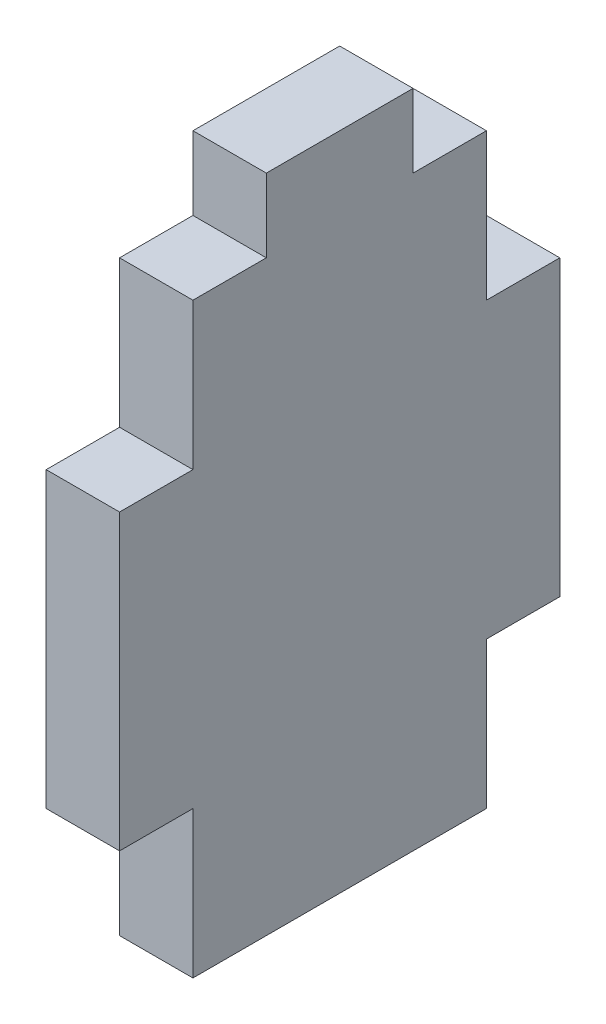
ISO-10303-21;
HEADER;
FILE_DESCRIPTION(('STEP AP214'),'2;1');
FILE_NAME('part.step','',(''),(''),'','','');
FILE_SCHEMA(('AUTOMOTIVE_DESIGN { 1 0 10303 214 1 1 1 1 }'));
ENDSEC;
DATA;
#1=APPLICATION_CONTEXT('core data for automotive mechanical design processes');
#2=APPLICATION_PROTOCOL_DEFINITION('international standard','automotive_design',2000,#1);
#3=PRODUCT_CONTEXT('',#1,'mechanical');
#4=PRODUCT('Part','Part','',(#3));
#5=PRODUCT_RELATED_PRODUCT_CATEGORY('part','',(#4));
#6=PRODUCT_DEFINITION_FORMATION('','',#4);
#7=PRODUCT_DEFINITION_CONTEXT('part definition',#1,'design');
#8=PRODUCT_DEFINITION('design','',#6,#7);
#9=PRODUCT_DEFINITION_SHAPE('','',#8);
#10=(LENGTH_UNIT() NAMED_UNIT(*) SI_UNIT(.MILLI.,.METRE.));
#11=(NAMED_UNIT(*) PLANE_ANGLE_UNIT() SI_UNIT($,.RADIAN.));
#12=(NAMED_UNIT(*) SI_UNIT($,.STERADIAN.) SOLID_ANGLE_UNIT());
#13=UNCERTAINTY_MEASURE_WITH_UNIT(LENGTH_MEASURE(1.E-05),#10,'distance_accuracy_value','');
#14=(GEOMETRIC_REPRESENTATION_CONTEXT(3) GLOBAL_UNCERTAINTY_ASSIGNED_CONTEXT((#13)) GLOBAL_UNIT_ASSIGNED_CONTEXT((#10,
#11,#12)) REPRESENTATION_CONTEXT('',''));
#15=CARTESIAN_POINT('',(0.,0.,0.));
#16=DIRECTION('',(0.,0.,1.));
#17=DIRECTION('',(1.,0.,0.));
#18=AXIS2_PLACEMENT_3D('',#15,#16,#17);
#19=CARTESIAN_POINT('',(5.,0.,0.));
#20=DIRECTION('',(0.,0.,1.));
#21=DIRECTION('',(0.,-1.,0.));
#22=AXIS2_PLACEMENT_3D('',#19,#20,#21);
#23=PLANE('',#22);
#24=DIRECTION('',(0.,1.,0.));
#25=VECTOR('',#24,1.);
#26=CARTESIAN_POINT('',(0.,0.,0.));
#27=LINE('',#26,#25);
#28=CARTESIAN_POINT('',(0.,0.,0.));
#29=VERTEX_POINT('',#28);
#30=CARTESIAN_POINT('',(0.,10.,0.));
#31=VERTEX_POINT('',#30);
#32=EDGE_CURVE('E178',#29,#31,#27,.T.);
#33=ORIENTED_EDGE('',*,*,#32,.T.);
#34=DIRECTION('',(-1.,0.,0.));
#35=VECTOR('',#34,1.);
#36=CARTESIAN_POINT('',(5.,10.,0.));
#37=LINE('',#36,#35);
#38=CARTESIAN_POINT('',(5.,10.,0.));
#39=VERTEX_POINT('',#38);
#40=EDGE_CURVE('E11',#39,#31,#37,.T.);
#41=ORIENTED_EDGE('',*,*,#40,.F.);
#42=DIRECTION('',(0.,1.,0.));
#43=VECTOR('',#42,1.);
#44=CARTESIAN_POINT('',(5.,0.,0.));
#45=LINE('',#44,#43);
#46=CARTESIAN_POINT('',(5.,0.,0.));
#47=VERTEX_POINT('',#46);
#48=EDGE_CURVE('E208',#47,#39,#45,.T.);
#49=ORIENTED_EDGE('',*,*,#48,.F.);
#50=DIRECTION('',(-1.,0.,0.));
#51=VECTOR('',#50,1.);
#52=CARTESIAN_POINT('',(5.,0.,0.));
#53=LINE('',#52,#51);
#54=EDGE_CURVE('E174',#47,#29,#53,.T.);
#55=ORIENTED_EDGE('',*,*,#54,.T.);
#56=EDGE_LOOP('',(#33,#41,#49,#55));
#57=FACE_BOUND('',#56,.T.);
#58=ADVANCED_FACE('F34',(#57),#23,.F.);
#59=CARTESIAN_POINT('',(5.,10.,0.));
#60=DIRECTION('',(0.,1.,0.));
#61=DIRECTION('',(0.,0.,1.));
#62=AXIS2_PLACEMENT_3D('',#59,#60,#61);
#63=PLANE('',#62);
#64=DIRECTION('',(0.,0.,-1.));
#65=VECTOR('',#64,1.);
#66=CARTESIAN_POINT('',(0.,10.,0.));
#67=LINE('',#66,#65);
#68=CARTESIAN_POINT('',(0.,10.,-5.));
#69=VERTEX_POINT('',#68);
#70=EDGE_CURVE('E181',#31,#69,#67,.T.);
#71=ORIENTED_EDGE('',*,*,#70,.T.);
#72=DIRECTION('',(-1.,0.,0.));
#73=VECTOR('',#72,1.);
#74=CARTESIAN_POINT('',(5.,10.,-5.));
#75=LINE('',#74,#73);
#76=CARTESIAN_POINT('',(5.,10.,-5.));
#77=VERTEX_POINT('',#76);
#78=EDGE_CURVE('E42',#77,#69,#75,.T.);
#79=ORIENTED_EDGE('',*,*,#78,.F.);
#80=DIRECTION('',(0.,0.,-1.));
#81=VECTOR('',#80,1.);
#82=CARTESIAN_POINT('',(5.,10.,0.));
#83=LINE('',#82,#81);
#84=EDGE_CURVE('E117',#39,#77,#83,.T.);
#85=ORIENTED_EDGE('',*,*,#84,.F.);
#86=ORIENTED_EDGE('',*,*,#40,.T.);
#87=EDGE_LOOP('',(#71,#79,#85,#86));
#88=FACE_BOUND('',#87,.T.);
#89=ADVANCED_FACE('F306',(#88),#63,.F.);
#90=CARTESIAN_POINT('',(5.,30.,-5.));
#91=DIRECTION('',(0.,0.,1.));
#92=DIRECTION('',(0.,-1.,0.));
#93=AXIS2_PLACEMENT_3D('',#90,#91,#92);
#94=PLANE('',#93);
#95=DIRECTION('',(0.,1.,0.));
#96=VECTOR('',#95,1.);
#97=CARTESIAN_POINT('',(0.,30.,-5.));
#98=LINE('',#97,#96);
#99=CARTESIAN_POINT('',(0.,30.,-5.));
#100=VERTEX_POINT('',#99);
#101=EDGE_CURVE('E183',#69,#100,#98,.T.);
#102=ORIENTED_EDGE('',*,*,#101,.T.);
#103=DIRECTION('',(-1.,0.,0.));
#104=VECTOR('',#103,1.);
#105=CARTESIAN_POINT('',(5.,30.,-5.));
#106=LINE('',#105,#104);
#107=CARTESIAN_POINT('',(5.,30.,-5.));
#108=VERTEX_POINT('',#107);
#109=EDGE_CURVE('E239',#108,#100,#106,.T.);
#110=ORIENTED_EDGE('',*,*,#109,.F.);
#111=DIRECTION('',(0.,1.,0.));
#112=VECTOR('',#111,1.);
#113=CARTESIAN_POINT('',(5.,30.,-5.));
#114=LINE('',#113,#112);
#115=EDGE_CURVE('E247',#77,#108,#114,.T.);
#116=ORIENTED_EDGE('',*,*,#115,.F.);
#117=ORIENTED_EDGE('',*,*,#78,.T.);
#118=EDGE_LOOP('',(#102,#110,#116,#117));
#119=FACE_BOUND('',#118,.T.);
#120=ADVANCED_FACE('F245',(#119),#94,.F.);
#121=CARTESIAN_POINT('',(5.,30.,0.));
#122=DIRECTION('',(0.,-1.,0.));
#123=DIRECTION('',(0.,0.,-1.));
#124=AXIS2_PLACEMENT_3D('',#121,#122,#123);
#125=PLANE('',#124);
#126=DIRECTION('',(0.,0.,1.));
#127=VECTOR('',#126,1.);
#128=CARTESIAN_POINT('',(0.,30.,0.));
#129=LINE('',#128,#127);
#130=CARTESIAN_POINT('',(0.,30.,0.));
#131=VERTEX_POINT('',#130);
#132=EDGE_CURVE('E185',#100,#131,#129,.T.);
#133=ORIENTED_EDGE('',*,*,#132,.T.);
#134=DIRECTION('',(-1.,0.,0.));
#135=VECTOR('',#134,1.);
#136=CARTESIAN_POINT('',(5.,30.,0.));
#137=LINE('',#136,#135);
#138=CARTESIAN_POINT('',(5.,30.,0.));
#139=VERTEX_POINT('',#138);
#140=EDGE_CURVE('E236',#139,#131,#137,.T.);
#141=ORIENTED_EDGE('',*,*,#140,.F.);
#142=DIRECTION('',(0.,0.,1.));
#143=VECTOR('',#142,1.);
#144=CARTESIAN_POINT('',(5.,30.,0.));
#145=LINE('',#144,#143);
#146=EDGE_CURVE('E265',#108,#139,#145,.T.);
#147=ORIENTED_EDGE('',*,*,#146,.F.);
#148=ORIENTED_EDGE('',*,*,#109,.T.);
#149=EDGE_LOOP('',(#133,#141,#147,#148));
#150=FACE_BOUND('',#149,.T.);
#151=ADVANCED_FACE('F256',(#150),#125,.F.);
#152=CARTESIAN_POINT('',(5.,30.,0.));
#153=DIRECTION('',(0.,0.,1.));
#154=DIRECTION('',(0.,-1.,0.));
#155=AXIS2_PLACEMENT_3D('',#152,#153,#154);
#156=PLANE('',#155);
#157=DIRECTION('',(0.,1.,0.));
#158=VECTOR('',#157,1.);
#159=CARTESIAN_POINT('',(0.,30.,0.));
#160=LINE('',#159,#158);
#161=CARTESIAN_POINT('',(0.,40.,0.));
#162=VERTEX_POINT('',#161);
#163=EDGE_CURVE('E187',#131,#162,#160,.T.);
#164=ORIENTED_EDGE('',*,*,#163,.T.);
#165=DIRECTION('',(-1.,0.,0.));
#166=VECTOR('',#165,1.);
#167=CARTESIAN_POINT('',(5.,40.,0.));
#168=LINE('',#167,#166);
#169=CARTESIAN_POINT('',(5.,40.,0.));
#170=VERTEX_POINT('',#169);
#171=EDGE_CURVE('E233',#170,#162,#168,.T.);
#172=ORIENTED_EDGE('',*,*,#171,.F.);
#173=DIRECTION('',(0.,1.,0.));
#174=VECTOR('',#173,1.);
#175=CARTESIAN_POINT('',(5.,30.,0.));
#176=LINE('',#175,#174);
#177=EDGE_CURVE('E262',#139,#170,#176,.T.);
#178=ORIENTED_EDGE('',*,*,#177,.F.);
#179=ORIENTED_EDGE('',*,*,#140,.T.);
#180=EDGE_LOOP('',(#164,#172,#178,#179));
#181=FACE_BOUND('',#180,.T.);
#182=ADVANCED_FACE('F260',(#181),#156,.F.);
#183=CARTESIAN_POINT('',(5.,40.,0.));
#184=DIRECTION('',(0.,-1.,0.));
#185=DIRECTION('',(0.,0.,-1.));
#186=AXIS2_PLACEMENT_3D('',#183,#184,#185);
#187=PLANE('',#186);
#188=DIRECTION('',(0.,0.,1.));
#189=VECTOR('',#188,1.);
#190=CARTESIAN_POINT('',(0.,40.,0.));
#191=LINE('',#190,#189);
#192=CARTESIAN_POINT('',(0.,40.,5.));
#193=VERTEX_POINT('',#192);
#194=EDGE_CURVE('E189',#162,#193,#191,.T.);
#195=ORIENTED_EDGE('',*,*,#194,.T.);
#196=DIRECTION('',(-1.,0.,0.));
#197=VECTOR('',#196,1.);
#198=CARTESIAN_POINT('',(5.,40.,5.));
#199=LINE('',#198,#197);
#200=CARTESIAN_POINT('',(5.,40.,5.));
#201=VERTEX_POINT('',#200);
#202=EDGE_CURVE('E230',#201,#193,#199,.T.);
#203=ORIENTED_EDGE('',*,*,#202,.F.);
#204=DIRECTION('',(0.,0.,1.));
#205=VECTOR('',#204,1.);
#206=CARTESIAN_POINT('',(5.,40.,0.));
#207=LINE('',#206,#205);
#208=EDGE_CURVE('E264',#170,#201,#207,.T.);
#209=ORIENTED_EDGE('',*,*,#208,.F.);
#210=ORIENTED_EDGE('',*,*,#171,.T.);
#211=EDGE_LOOP('',(#195,#203,#209,#210));
#212=FACE_BOUND('',#211,.T.);
#213=ADVANCED_FACE('F319',(#212),#187,.F.);
#214=CARTESIAN_POINT('',(5.,40.,5.));
#215=DIRECTION('',(0.,0.,1.));
#216=DIRECTION('',(0.,-1.,0.));
#217=AXIS2_PLACEMENT_3D('',#214,#215,#216);
#218=PLANE('',#217);
#219=DIRECTION('',(0.,1.,0.));
#220=VECTOR('',#219,1.);
#221=CARTESIAN_POINT('',(0.,40.,5.));
#222=LINE('',#221,#220);
#223=CARTESIAN_POINT('',(0.,45.,5.));
#224=VERTEX_POINT('',#223);
#225=EDGE_CURVE('E191',#193,#224,#222,.T.);
#226=ORIENTED_EDGE('',*,*,#225,.T.);
#227=DIRECTION('',(-1.,0.,0.));
#228=VECTOR('',#227,1.);
#229=CARTESIAN_POINT('',(5.,45.,5.));
#230=LINE('',#229,#228);
#231=CARTESIAN_POINT('',(5.,45.,5.));
#232=VERTEX_POINT('',#231);
#233=EDGE_CURVE('E227',#232,#224,#230,.T.);
#234=ORIENTED_EDGE('',*,*,#233,.F.);
#235=DIRECTION('',(0.,1.,0.));
#236=VECTOR('',#235,1.);
#237=CARTESIAN_POINT('',(5.,40.,5.));
#238=LINE('',#237,#236);
#239=EDGE_CURVE('E267',#201,#232,#238,.T.);
#240=ORIENTED_EDGE('',*,*,#239,.F.);
#241=ORIENTED_EDGE('',*,*,#202,.T.);
#242=EDGE_LOOP('',(#226,#234,#240,#241));
#243=FACE_BOUND('',#242,.T.);
#244=ADVANCED_FACE('F322',(#243),#218,.F.);
#245=CARTESIAN_POINT('',(5.,45.,15.));
#246=DIRECTION('',(0.,-1.,0.));
#247=DIRECTION('',(0.,0.,-1.));
#248=AXIS2_PLACEMENT_3D('',#245,#246,#247);
#249=PLANE('',#248);
#250=DIRECTION('',(0.,0.,1.));
#251=VECTOR('',#250,1.);
#252=CARTESIAN_POINT('',(0.,45.,15.));
#253=LINE('',#252,#251);
#254=CARTESIAN_POINT('',(0.,45.,15.));
#255=VERTEX_POINT('',#254);
#256=EDGE_CURVE('E193',#224,#255,#253,.T.);
#257=ORIENTED_EDGE('',*,*,#256,.T.);
#258=DIRECTION('',(-1.,0.,0.));
#259=VECTOR('',#258,1.);
#260=CARTESIAN_POINT('',(5.,45.,15.));
#261=LINE('',#260,#259);
#262=CARTESIAN_POINT('',(5.,45.,15.));
#263=VERTEX_POINT('',#262);
#264=EDGE_CURVE('E224',#263,#255,#261,.T.);
#265=ORIENTED_EDGE('',*,*,#264,.F.);
#266=DIRECTION('',(0.,0.,1.));
#267=VECTOR('',#266,1.);
#268=CARTESIAN_POINT('',(5.,45.,15.));
#269=LINE('',#268,#267);
#270=EDGE_CURVE('E273',#232,#263,#269,.T.);
#271=ORIENTED_EDGE('',*,*,#270,.F.);
#272=ORIENTED_EDGE('',*,*,#233,.T.);
#273=EDGE_LOOP('',(#257,#265,#271,#272));
#274=FACE_BOUND('',#273,.T.);
#275=ADVANCED_FACE('F326',(#274),#249,.F.);
#276=CARTESIAN_POINT('',(5.,40.,15.));
#277=DIRECTION('',(0.,0.,-1.));
#278=DIRECTION('',(-1.,0.,0.));
#279=AXIS2_PLACEMENT_3D('',#276,#277,#278);
#280=PLANE('',#279);
#281=DIRECTION('',(0.,-1.,0.));
#282=VECTOR('',#281,1.);
#283=CARTESIAN_POINT('',(0.,40.,15.));
#284=LINE('',#283,#282);
#285=CARTESIAN_POINT('',(0.,40.,15.));
#286=VERTEX_POINT('',#285);
#287=EDGE_CURVE('E195',#255,#286,#284,.T.);
#288=ORIENTED_EDGE('',*,*,#287,.T.);
#289=DIRECTION('',(-1.,0.,0.));
#290=VECTOR('',#289,1.);
#291=CARTESIAN_POINT('',(5.,40.,15.));
#292=LINE('',#291,#290);
#293=CARTESIAN_POINT('',(5.,40.,15.));
#294=VERTEX_POINT('',#293);
#295=EDGE_CURVE('E221',#294,#286,#292,.T.);
#296=ORIENTED_EDGE('',*,*,#295,.F.);
#297=DIRECTION('',(0.,-1.,0.));
#298=VECTOR('',#297,1.);
#299=CARTESIAN_POINT('',(5.,40.,15.));
#300=LINE('',#299,#298);
#301=EDGE_CURVE('E275',#263,#294,#300,.T.);
#302=ORIENTED_EDGE('',*,*,#301,.F.);
#303=ORIENTED_EDGE('',*,*,#264,.T.);
#304=EDGE_LOOP('',(#288,#296,#302,#303));
#305=FACE_BOUND('',#304,.T.);
#306=ADVANCED_FACE('F330',(#305),#280,.F.);
#307=CARTESIAN_POINT('',(5.,40.,15.));
#308=DIRECTION('',(0.,-1.,0.));
#309=DIRECTION('',(0.,0.,-1.));
#310=AXIS2_PLACEMENT_3D('',#307,#308,#309);
#311=PLANE('',#310);
#312=DIRECTION('',(0.,0.,1.));
#313=VECTOR('',#312,1.);
#314=CARTESIAN_POINT('',(0.,40.,15.));
#315=LINE('',#314,#313);
#316=CARTESIAN_POINT('',(0.,40.,20.));
#317=VERTEX_POINT('',#316);
#318=EDGE_CURVE('E197',#286,#317,#315,.T.);
#319=ORIENTED_EDGE('',*,*,#318,.T.);
#320=DIRECTION('',(-1.,0.,0.));
#321=VECTOR('',#320,1.);
#322=CARTESIAN_POINT('',(5.,40.,20.));
#323=LINE('',#322,#321);
#324=CARTESIAN_POINT('',(5.,40.,20.));
#325=VERTEX_POINT('',#324);
#326=EDGE_CURVE('E218',#325,#317,#323,.T.);
#327=ORIENTED_EDGE('',*,*,#326,.F.);
#328=DIRECTION('',(0.,0.,1.));
#329=VECTOR('',#328,1.);
#330=CARTESIAN_POINT('',(5.,40.,15.));
#331=LINE('',#330,#329);
#332=EDGE_CURVE('E277',#294,#325,#331,.T.);
#333=ORIENTED_EDGE('',*,*,#332,.F.);
#334=ORIENTED_EDGE('',*,*,#295,.T.);
#335=EDGE_LOOP('',(#319,#327,#333,#334));
#336=FACE_BOUND('',#335,.T.);
#337=ADVANCED_FACE('F334',(#336),#311,.F.);
#338=CARTESIAN_POINT('',(5.,30.,20.));
#339=DIRECTION('',(0.,0.,-1.));
#340=DIRECTION('',(-1.,0.,0.));
#341=AXIS2_PLACEMENT_3D('',#338,#339,#340);
#342=PLANE('',#341);
#343=DIRECTION('',(0.,-1.,0.));
#344=VECTOR('',#343,1.);
#345=CARTESIAN_POINT('',(0.,30.,20.));
#346=LINE('',#345,#344);
#347=CARTESIAN_POINT('',(0.,30.,20.));
#348=VERTEX_POINT('',#347);
#349=EDGE_CURVE('E199',#317,#348,#346,.T.);
#350=ORIENTED_EDGE('',*,*,#349,.T.);
#351=DIRECTION('',(-1.,0.,0.));
#352=VECTOR('',#351,1.);
#353=CARTESIAN_POINT('',(5.,30.,20.));
#354=LINE('',#353,#352);
#355=CARTESIAN_POINT('',(5.,30.,20.));
#356=VERTEX_POINT('',#355);
#357=EDGE_CURVE('E215',#356,#348,#354,.T.);
#358=ORIENTED_EDGE('',*,*,#357,.F.);
#359=DIRECTION('',(0.,-1.,0.));
#360=VECTOR('',#359,1.);
#361=CARTESIAN_POINT('',(5.,30.,20.));
#362=LINE('',#361,#360);
#363=EDGE_CURVE('E279',#325,#356,#362,.T.);
#364=ORIENTED_EDGE('',*,*,#363,.F.);
#365=ORIENTED_EDGE('',*,*,#326,.T.);
#366=EDGE_LOOP('',(#350,#358,#364,#365));
#367=FACE_BOUND('',#366,.T.);
#368=ADVANCED_FACE('F338',(#367),#342,.F.);
#369=CARTESIAN_POINT('',(5.,30.,20.));
#370=DIRECTION('',(0.,-1.,0.));
#371=DIRECTION('',(0.,0.,-1.));
#372=AXIS2_PLACEMENT_3D('',#369,#370,#371);
#373=PLANE('',#372);
#374=DIRECTION('',(0.,0.,1.));
#375=VECTOR('',#374,1.);
#376=CARTESIAN_POINT('',(0.,30.,20.));
#377=LINE('',#376,#375);
#378=CARTESIAN_POINT('',(0.,30.,25.));
#379=VERTEX_POINT('',#378);
#380=EDGE_CURVE('E201',#348,#379,#377,.T.);
#381=ORIENTED_EDGE('',*,*,#380,.T.);
#382=DIRECTION('',(-1.,0.,0.));
#383=VECTOR('',#382,1.);
#384=CARTESIAN_POINT('',(5.,30.,25.));
#385=LINE('',#384,#383);
#386=CARTESIAN_POINT('',(5.,30.,25.));
#387=VERTEX_POINT('',#386);
#388=EDGE_CURVE('E212',#387,#379,#385,.T.);
#389=ORIENTED_EDGE('',*,*,#388,.F.);
#390=DIRECTION('',(0.,0.,1.));
#391=VECTOR('',#390,1.);
#392=CARTESIAN_POINT('',(5.,30.,20.));
#393=LINE('',#392,#391);
#394=EDGE_CURVE('E281',#356,#387,#393,.T.);
#395=ORIENTED_EDGE('',*,*,#394,.F.);
#396=ORIENTED_EDGE('',*,*,#357,.T.);
#397=EDGE_LOOP('',(#381,#389,#395,#396));
#398=FACE_BOUND('',#397,.T.);
#399=ADVANCED_FACE('F287',(#398),#373,.F.);
#400=CARTESIAN_POINT('',(5.,30.,25.));
#401=DIRECTION('',(0.,0.,-1.));
#402=DIRECTION('',(0.,1.,0.));
#403=AXIS2_PLACEMENT_3D('',#400,#401,#402);
#404=PLANE('',#403);
#405=DIRECTION('',(0.,-1.,0.));
#406=VECTOR('',#405,1.);
#407=CARTESIAN_POINT('',(0.,30.,25.));
#408=LINE('',#407,#406);
#409=CARTESIAN_POINT('',(0.,10.,25.));
#410=VERTEX_POINT('',#409);
#411=EDGE_CURVE('E203',#379,#410,#408,.T.);
#412=ORIENTED_EDGE('',*,*,#411,.T.);
#413=DIRECTION('',(-1.,0.,0.));
#414=VECTOR('',#413,1.);
#415=CARTESIAN_POINT('',(5.,10.,25.));
#416=LINE('',#415,#414);
#417=CARTESIAN_POINT('',(5.,10.,25.));
#418=VERTEX_POINT('',#417);
#419=EDGE_CURVE('E169',#418,#410,#416,.T.);
#420=ORIENTED_EDGE('',*,*,#419,.F.);
#421=DIRECTION('',(0.,-1.,0.));
#422=VECTOR('',#421,1.);
#423=CARTESIAN_POINT('',(5.,30.,25.));
#424=LINE('',#423,#422);
#425=EDGE_CURVE('E160',#387,#418,#424,.T.);
#426=ORIENTED_EDGE('',*,*,#425,.F.);
#427=ORIENTED_EDGE('',*,*,#388,.T.);
#428=EDGE_LOOP('',(#412,#420,#426,#427));
#429=FACE_BOUND('',#428,.T.);
#430=ADVANCED_FACE('F291',(#429),#404,.F.);
#431=CARTESIAN_POINT('',(5.,10.,20.));
#432=DIRECTION('',(0.,1.,0.));
#433=DIRECTION('',(0.,0.,1.));
#434=AXIS2_PLACEMENT_3D('',#431,#432,#433);
#435=PLANE('',#434);
#436=DIRECTION('',(0.,0.,-1.));
#437=VECTOR('',#436,1.);
#438=CARTESIAN_POINT('',(0.,10.,20.));
#439=LINE('',#438,#437);
#440=CARTESIAN_POINT('',(0.,10.,20.));
#441=VERTEX_POINT('',#440);
#442=EDGE_CURVE('E168',#410,#441,#439,.T.);
#443=ORIENTED_EDGE('',*,*,#442,.T.);
#444=DIRECTION('',(-1.,0.,0.));
#445=VECTOR('',#444,1.);
#446=CARTESIAN_POINT('',(5.,10.,20.));
#447=LINE('',#446,#445);
#448=CARTESIAN_POINT('',(5.,10.,20.));
#449=VERTEX_POINT('',#448);
#450=EDGE_CURVE('E165',#449,#441,#447,.T.);
#451=ORIENTED_EDGE('',*,*,#450,.F.);
#452=DIRECTION('',(0.,0.,-1.));
#453=VECTOR('',#452,1.);
#454=CARTESIAN_POINT('',(5.,10.,20.));
#455=LINE('',#454,#453);
#456=EDGE_CURVE('E154',#418,#449,#455,.T.);
#457=ORIENTED_EDGE('',*,*,#456,.F.);
#458=ORIENTED_EDGE('',*,*,#419,.T.);
#459=EDGE_LOOP('',(#443,#451,#457,#458));
#460=FACE_BOUND('',#459,.T.);
#461=ADVANCED_FACE('F166',(#460),#435,.F.);
#462=CARTESIAN_POINT('',(5.,0.,20.));
#463=DIRECTION('',(0.,0.,-1.));
#464=DIRECTION('',(0.,1.,0.));
#465=AXIS2_PLACEMENT_3D('',#462,#463,#464);
#466=PLANE('',#465);
#467=DIRECTION('',(0.,-1.,0.));
#468=VECTOR('',#467,1.);
#469=CARTESIAN_POINT('',(0.,0.,20.));
#470=LINE('',#469,#468);
#471=CARTESIAN_POINT('',(0.,0.,20.));
#472=VERTEX_POINT('',#471);
#473=EDGE_CURVE('E103',#441,#472,#470,.T.);
#474=ORIENTED_EDGE('',*,*,#473,.T.);
#475=DIRECTION('',(-1.,0.,0.));
#476=VECTOR('',#475,1.);
#477=CARTESIAN_POINT('',(5.,0.,20.));
#478=LINE('',#477,#476);
#479=CARTESIAN_POINT('',(5.,0.,20.));
#480=VERTEX_POINT('',#479);
#481=EDGE_CURVE('E170',#480,#472,#478,.T.);
#482=ORIENTED_EDGE('',*,*,#481,.F.);
#483=DIRECTION('',(0.,-1.,0.));
#484=VECTOR('',#483,1.);
#485=CARTESIAN_POINT('',(5.,0.,20.));
#486=LINE('',#485,#484);
#487=EDGE_CURVE('E158',#449,#480,#486,.T.);
#488=ORIENTED_EDGE('',*,*,#487,.F.);
#489=ORIENTED_EDGE('',*,*,#450,.T.);
#490=EDGE_LOOP('',(#474,#482,#488,#489));
#491=FACE_BOUND('',#490,.T.);
#492=ADVANCED_FACE('F172',(#491),#466,.F.);
#493=CARTESIAN_POINT('',(5.,0.,0.));
#494=DIRECTION('',(0.,1.,0.));
#495=DIRECTION('',(0.,0.,1.));
#496=AXIS2_PLACEMENT_3D('',#493,#494,#495);
#497=PLANE('',#496);
#498=DIRECTION('',(0.,0.,-1.));
#499=VECTOR('',#498,1.);
#500=CARTESIAN_POINT('',(0.,0.,0.));
#501=LINE('',#500,#499);
#502=EDGE_CURVE('E109',#472,#29,#501,.T.);
#503=ORIENTED_EDGE('',*,*,#502,.T.);
#504=ORIENTED_EDGE('',*,*,#54,.F.);
#505=DIRECTION('',(0.,0.,-1.));
#506=VECTOR('',#505,1.);
#507=CARTESIAN_POINT('',(5.,0.,0.));
#508=LINE('',#507,#506);
#509=EDGE_CURVE('E50',#480,#47,#508,.T.);
#510=ORIENTED_EDGE('',*,*,#509,.F.);
#511=ORIENTED_EDGE('',*,*,#481,.T.);
#512=EDGE_LOOP('',(#503,#504,#510,#511));
#513=FACE_BOUND('',#512,.T.);
#514=ADVANCED_FACE('F295',(#513),#497,.F.);
#515=CARTESIAN_POINT('',(5.,0.,0.));
#516=DIRECTION('',(-1.,0.,0.));
#517=DIRECTION('',(0.,0.,1.));
#518=AXIS2_PLACEMENT_3D('',#515,#516,#517);
#519=PLANE('',#518);
#520=ORIENTED_EDGE('',*,*,#48,.T.);
#521=ORIENTED_EDGE('',*,*,#84,.T.);
#522=ORIENTED_EDGE('',*,*,#115,.T.);
#523=ORIENTED_EDGE('',*,*,#146,.T.);
#524=ORIENTED_EDGE('',*,*,#177,.T.);
#525=ORIENTED_EDGE('',*,*,#208,.T.);
#526=ORIENTED_EDGE('',*,*,#239,.T.);
#527=ORIENTED_EDGE('',*,*,#270,.T.);
#528=ORIENTED_EDGE('',*,*,#301,.T.);
#529=ORIENTED_EDGE('',*,*,#332,.T.);
#530=ORIENTED_EDGE('',*,*,#363,.T.);
#531=ORIENTED_EDGE('',*,*,#394,.T.);
#532=ORIENTED_EDGE('',*,*,#425,.T.);
#533=ORIENTED_EDGE('',*,*,#456,.T.);
#534=ORIENTED_EDGE('',*,*,#487,.T.);
#535=ORIENTED_EDGE('',*,*,#509,.T.);
#536=EDGE_LOOP('',(#520,#521,#522,#523,#524,#525,#526,#527,#528,#529,#530,#531,#532,#533,#534,#535));
#537=FACE_BOUND('',#536,.T.);
#538=ADVANCED_FACE('F156',(#537),#519,.F.);
#539=CARTESIAN_POINT('',(0.,0.,0.));
#540=DIRECTION('',(-1.,0.,0.));
#541=DIRECTION('',(0.,0.,1.));
#542=AXIS2_PLACEMENT_3D('',#539,#540,#541);
#543=PLANE('',#542);
#544=ORIENTED_EDGE('',*,*,#32,.F.);
#545=ORIENTED_EDGE('',*,*,#502,.F.);
#546=ORIENTED_EDGE('',*,*,#473,.F.);
#547=ORIENTED_EDGE('',*,*,#442,.F.);
#548=ORIENTED_EDGE('',*,*,#411,.F.);
#549=ORIENTED_EDGE('',*,*,#380,.F.);
#550=ORIENTED_EDGE('',*,*,#349,.F.);
#551=ORIENTED_EDGE('',*,*,#318,.F.);
#552=ORIENTED_EDGE('',*,*,#287,.F.);
#553=ORIENTED_EDGE('',*,*,#256,.F.);
#554=ORIENTED_EDGE('',*,*,#225,.F.);
#555=ORIENTED_EDGE('',*,*,#194,.F.);
#556=ORIENTED_EDGE('',*,*,#163,.F.);
#557=ORIENTED_EDGE('',*,*,#132,.F.);
#558=ORIENTED_EDGE('',*,*,#101,.F.);
#559=ORIENTED_EDGE('',*,*,#70,.F.);
#560=EDGE_LOOP('',(#544,#545,#546,#547,#548,#549,#550,#551,#552,#553,#554,#555,#556,#557,#558,#559));
#561=FACE_BOUND('',#560,.T.);
#562=ADVANCED_FACE('F251',(#561),#543,.T.);
#563=CLOSED_SHELL('',(#58,#89,#120,#151,#182,#213,#244,#275,#306,#337,#368,#399,#430,#461,#492,
#514,#538,#562));
#564=MANIFOLD_SOLID_BREP('B2',#563);
#565=ADVANCED_BREP_SHAPE_REPRESENTATION('',(#18,#564),#14);
#566=SHAPE_DEFINITION_REPRESENTATION(#9,#565);
ENDSEC;
END-ISO-10303-21;
